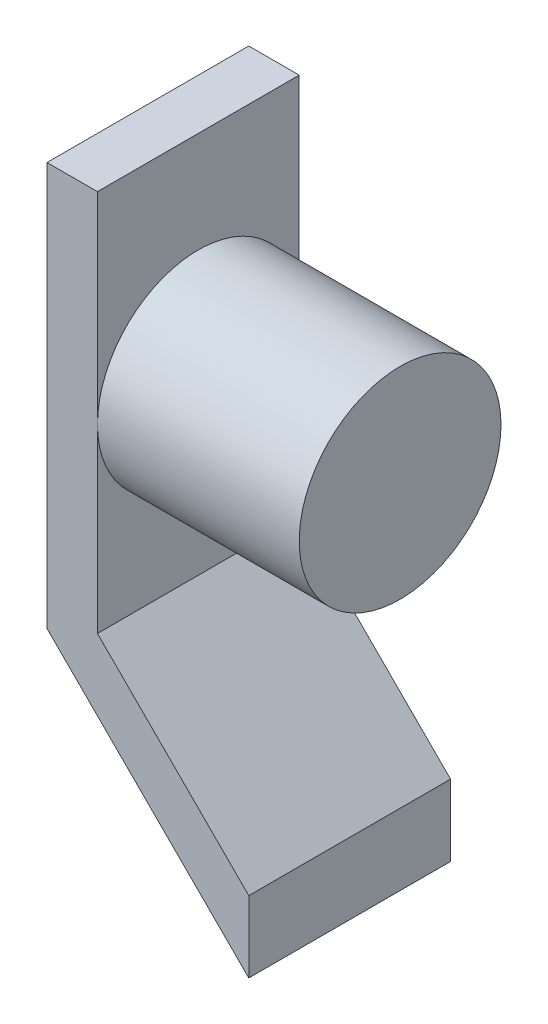
ISO-10303-21;
HEADER;
FILE_DESCRIPTION(('STEP AP214'),'2;1');
FILE_NAME('part.step','',(''),(''),'','','');
FILE_SCHEMA(('AUTOMOTIVE_DESIGN { 1 0 10303 214 1 1 1 1 }'));
ENDSEC;
DATA;
#1=APPLICATION_CONTEXT('core data for automotive mechanical design processes');
#2=APPLICATION_PROTOCOL_DEFINITION('international standard','automotive_design',2000,#1);
#3=PRODUCT_CONTEXT('',#1,'mechanical');
#4=PRODUCT('Part','Part','',(#3));
#5=PRODUCT_RELATED_PRODUCT_CATEGORY('part','',(#4));
#6=PRODUCT_DEFINITION_FORMATION('','',#4);
#7=PRODUCT_DEFINITION_CONTEXT('part definition',#1,'design');
#8=PRODUCT_DEFINITION('design','',#6,#7);
#9=PRODUCT_DEFINITION_SHAPE('','',#8);
#10=(LENGTH_UNIT() NAMED_UNIT(*) SI_UNIT(.MILLI.,.METRE.));
#11=(NAMED_UNIT(*) PLANE_ANGLE_UNIT() SI_UNIT($,.RADIAN.));
#12=(NAMED_UNIT(*) SI_UNIT($,.STERADIAN.) SOLID_ANGLE_UNIT());
#13=UNCERTAINTY_MEASURE_WITH_UNIT(LENGTH_MEASURE(1.E-05),#10,'distance_accuracy_value','');
#14=(GEOMETRIC_REPRESENTATION_CONTEXT(3) GLOBAL_UNCERTAINTY_ASSIGNED_CONTEXT((#13)) GLOBAL_UNIT_ASSIGNED_CONTEXT((#10,
#11,#12)) REPRESENTATION_CONTEXT('',''));
#15=CARTESIAN_POINT('',(0.,0.,0.));
#16=DIRECTION('',(0.,0.,1.));
#17=DIRECTION('',(1.,0.,0.));
#18=AXIS2_PLACEMENT_3D('',#15,#16,#17);
#19=CARTESIAN_POINT('',(3.175,22.225,12.7));
#20=DIRECTION('',(-1.,0.,0.));
#21=DIRECTION('',(0.,0.,1.));
#22=AXIS2_PLACEMENT_3D('',#19,#20,#21);
#23=PLANE('',#22);
#24=CARTESIAN_POINT('',(3.175,12.7,6.35));
#25=DIRECTION('',(1.,0.,0.));
#26=DIRECTION('',(0.,0.,-1.));
#27=AXIS2_PLACEMENT_3D('',#24,#25,#26);
#28=CIRCLE('',#27,6.35);
#29=CARTESIAN_POINT('',(3.175,12.7,12.7));
#30=VERTEX_POINT('',#29);
#31=CARTESIAN_POINT('',(3.175,12.7,0.));
#32=VERTEX_POINT('',#31);
#33=EDGE_CURVE('E169',#30,#32,#28,.T.);
#34=ORIENTED_EDGE('',*,*,#33,.F.);
#35=DIRECTION('',(0.,1.,0.));
#36=VECTOR('',#35,1.);
#37=CARTESIAN_POINT('',(3.175,1.31512806053458,12.7));
#38=LINE('',#37,#36);
#39=CARTESIAN_POINT('',(3.175,1.31512806053458,12.7));
#40=VERTEX_POINT('',#39);
#41=EDGE_CURVE('E114',#40,#30,#38,.T.);
#42=ORIENTED_EDGE('',*,*,#41,.F.);
#43=DIRECTION('',(0.,0.,-1.));
#44=VECTOR('',#43,1.);
#45=CARTESIAN_POINT('',(3.175,1.31512806053458,12.7));
#46=LINE('',#45,#44);
#47=CARTESIAN_POINT('',(3.175,1.31512806053458,0.));
#48=VERTEX_POINT('',#47);
#49=EDGE_CURVE('E124',#40,#48,#46,.T.);
#50=ORIENTED_EDGE('',*,*,#49,.T.);
#51=DIRECTION('',(0.,1.,0.));
#52=VECTOR('',#51,1.);
#53=CARTESIAN_POINT('',(3.175,22.225,0.));
#54=LINE('',#53,#52);
#55=EDGE_CURVE('E146',#48,#32,#54,.T.);
#56=ORIENTED_EDGE('',*,*,#55,.T.);
#57=EDGE_LOOP('',(#34,#42,#50,#56));
#58=FACE_BOUND('',#57,.T.);
#59=ADVANCED_FACE('F38',(#58),#23,.F.);
#60=EDGE_CURVE('E54',#32,#30,#28,.T.);
#61=ORIENTED_EDGE('',*,*,#60,.F.);
#62=CARTESIAN_POINT('',(3.175,25.4,0.));
#63=VERTEX_POINT('',#62);
#64=EDGE_CURVE('E121',#32,#63,#54,.T.);
#65=ORIENTED_EDGE('',*,*,#64,.T.);
#66=DIRECTION('',(0.,0.,-1.));
#67=VECTOR('',#66,1.);
#68=CARTESIAN_POINT('',(3.175,25.4,12.7));
#69=LINE('',#68,#67);
#70=CARTESIAN_POINT('',(3.175,25.4,12.7));
#71=VERTEX_POINT('',#70);
#72=EDGE_CURVE('E119',#71,#63,#69,.T.);
#73=ORIENTED_EDGE('',*,*,#72,.F.);
#74=EDGE_CURVE('E107',#30,#71,#38,.T.);
#75=ORIENTED_EDGE('',*,*,#74,.F.);
#76=EDGE_LOOP('',(#61,#65,#73,#75));
#77=FACE_BOUND('',#76,.T.);
#78=ADVANCED_FACE('F120',(#77),#23,.F.);
#79=CARTESIAN_POINT('',(12.7,-12.7,12.7));
#80=DIRECTION('',(0.707106781186548,0.707106781186548,0.));
#81=DIRECTION('',(-0.707106781186548,0.707106781186548,0.));
#82=AXIS2_PLACEMENT_3D('',#79,#80,#81);
#83=PLANE('',#82);
#84=DIRECTION('',(0.707106781186547,-0.707106781186547,0.));
#85=VECTOR('',#84,1.);
#86=CARTESIAN_POINT('',(12.7,-12.7,0.));
#87=LINE('',#86,#85);
#88=CARTESIAN_POINT('',(0.,0.,0.));
#89=VERTEX_POINT('',#88);
#90=CARTESIAN_POINT('',(12.7,-12.7,0.));
#91=VERTEX_POINT('',#90);
#92=EDGE_CURVE('E133',#89,#91,#87,.T.);
#93=ORIENTED_EDGE('',*,*,#92,.T.);
#94=DIRECTION('',(0.,0.,-1.));
#95=VECTOR('',#94,1.);
#96=CARTESIAN_POINT('',(12.7,-12.7,12.7));
#97=LINE('',#96,#95);
#98=CARTESIAN_POINT('',(12.7,-12.7,12.7));
#99=VERTEX_POINT('',#98);
#100=EDGE_CURVE('E11',#99,#91,#97,.T.);
#101=ORIENTED_EDGE('',*,*,#100,.F.);
#102=DIRECTION('',(0.707106781186547,-0.707106781186547,0.));
#103=VECTOR('',#102,1.);
#104=CARTESIAN_POINT('',(12.7,-12.7,12.7));
#105=LINE('',#104,#103);
#106=CARTESIAN_POINT('',(0.,0.,12.7));
#107=VERTEX_POINT('',#106);
#108=EDGE_CURVE('E152',#107,#99,#105,.T.);
#109=ORIENTED_EDGE('',*,*,#108,.F.);
#110=DIRECTION('',(0.,0.,-1.));
#111=VECTOR('',#110,1.);
#112=CARTESIAN_POINT('',(0.,0.,12.7));
#113=LINE('',#112,#111);
#114=EDGE_CURVE('E129',#107,#89,#113,.T.);
#115=ORIENTED_EDGE('',*,*,#114,.T.);
#116=EDGE_LOOP('',(#93,#101,#109,#115));
#117=FACE_BOUND('',#116,.T.);
#118=ADVANCED_FACE('F40',(#117),#83,.F.);
#119=CARTESIAN_POINT('',(12.7,-12.7,12.7));
#120=DIRECTION('',(-1.,0.,0.));
#121=DIRECTION('',(0.,0.,1.));
#122=AXIS2_PLACEMENT_3D('',#119,#120,#121);
#123=PLANE('',#122);
#124=DIRECTION('',(0.,1.,0.));
#125=VECTOR('',#124,1.);
#126=CARTESIAN_POINT('',(12.7,-12.7,0.));
#127=LINE('',#126,#125);
#128=CARTESIAN_POINT('',(12.7,-8.20987193946542,0.));
#129=VERTEX_POINT('',#128);
#130=EDGE_CURVE('E137',#91,#129,#127,.T.);
#131=ORIENTED_EDGE('',*,*,#130,.T.);
#132=DIRECTION('',(0.,0.,-1.));
#133=VECTOR('',#132,1.);
#134=CARTESIAN_POINT('',(12.7,-8.20987193946542,12.7));
#135=LINE('',#134,#133);
#136=CARTESIAN_POINT('',(12.7,-8.20987193946542,12.7));
#137=VERTEX_POINT('',#136);
#138=EDGE_CURVE('E47',#137,#129,#135,.T.);
#139=ORIENTED_EDGE('',*,*,#138,.F.);
#140=DIRECTION('',(0.,1.,0.));
#141=VECTOR('',#140,1.);
#142=CARTESIAN_POINT('',(12.7,-12.7,12.7));
#143=LINE('',#142,#141);
#144=EDGE_CURVE('E99',#99,#137,#143,.T.);
#145=ORIENTED_EDGE('',*,*,#144,.F.);
#146=ORIENTED_EDGE('',*,*,#100,.T.);
#147=EDGE_LOOP('',(#131,#139,#145,#146));
#148=FACE_BOUND('',#147,.T.);
#149=ADVANCED_FACE('F162',(#148),#123,.F.);
#150=CARTESIAN_POINT('',(9.525,-5.03487193946542,12.7));
#151=DIRECTION('',(-0.707106781186548,-0.707106781186547,0.));
#152=DIRECTION('',(0.707106781186547,-0.707106781186548,0.));
#153=AXIS2_PLACEMENT_3D('',#150,#151,#152);
#154=PLANE('',#153);
#155=DIRECTION('',(-0.707106781186547,0.707106781186548,0.));
#156=VECTOR('',#155,1.);
#157=CARTESIAN_POINT('',(9.525,-5.03487193946542,0.));
#158=LINE('',#157,#156);
#159=EDGE_CURVE('E142',#129,#48,#158,.T.);
#160=ORIENTED_EDGE('',*,*,#159,.T.);
#161=ORIENTED_EDGE('',*,*,#49,.F.);
#162=DIRECTION('',(-0.707106781186548,0.707106781186547,0.));
#163=VECTOR('',#162,1.);
#164=CARTESIAN_POINT('',(9.525,-5.03487193946542,12.7));
#165=LINE('',#164,#163);
#166=EDGE_CURVE('E116',#137,#40,#165,.T.);
#167=ORIENTED_EDGE('',*,*,#166,.F.);
#168=ORIENTED_EDGE('',*,*,#138,.T.);
#169=EDGE_LOOP('',(#160,#161,#167,#168));
#170=FACE_BOUND('',#169,.T.);
#171=ADVANCED_FACE('F160',(#170),#154,.F.);
#172=CARTESIAN_POINT('',(0.,25.4,12.7));
#173=DIRECTION('',(0.,-1.,0.));
#174=DIRECTION('',(0.,0.,-1.));
#175=AXIS2_PLACEMENT_3D('',#172,#173,#174);
#176=PLANE('',#175);
#177=DIRECTION('',(-1.,0.,0.));
#178=VECTOR('',#177,1.);
#179=CARTESIAN_POINT('',(0.,25.4,0.));
#180=LINE('',#179,#178);
#181=CARTESIAN_POINT('',(0.,25.4,0.));
#182=VERTEX_POINT('',#181);
#183=EDGE_CURVE('E149',#63,#182,#180,.T.);
#184=ORIENTED_EDGE('',*,*,#183,.T.);
#185=DIRECTION('',(0.,0.,-1.));
#186=VECTOR('',#185,1.);
#187=CARTESIAN_POINT('',(0.,25.4,12.7));
#188=LINE('',#187,#186);
#189=CARTESIAN_POINT('',(0.,25.4,12.7));
#190=VERTEX_POINT('',#189);
#191=EDGE_CURVE('E125',#190,#182,#188,.T.);
#192=ORIENTED_EDGE('',*,*,#191,.F.);
#193=DIRECTION('',(-1.,0.,0.));
#194=VECTOR('',#193,1.);
#195=CARTESIAN_POINT('',(0.,25.4,12.7));
#196=LINE('',#195,#194);
#197=EDGE_CURVE('E111',#71,#190,#196,.T.);
#198=ORIENTED_EDGE('',*,*,#197,.F.);
#199=ORIENTED_EDGE('',*,*,#72,.T.);
#200=EDGE_LOOP('',(#184,#192,#198,#199));
#201=FACE_BOUND('',#200,.T.);
#202=ADVANCED_FACE('F127',(#201),#176,.F.);
#203=CARTESIAN_POINT('',(0.,0.,12.7));
#204=DIRECTION('',(1.,0.,0.));
#205=DIRECTION('',(0.,0.,-1.));
#206=AXIS2_PLACEMENT_3D('',#203,#204,#205);
#207=PLANE('',#206);
#208=DIRECTION('',(0.,-1.,0.));
#209=VECTOR('',#208,1.);
#210=CARTESIAN_POINT('',(0.,0.,0.));
#211=LINE('',#210,#209);
#212=EDGE_CURVE('E91',#182,#89,#211,.T.);
#213=ORIENTED_EDGE('',*,*,#212,.T.);
#214=ORIENTED_EDGE('',*,*,#114,.F.);
#215=DIRECTION('',(0.,-1.,0.));
#216=VECTOR('',#215,1.);
#217=CARTESIAN_POINT('',(0.,0.,12.7));
#218=LINE('',#217,#216);
#219=EDGE_CURVE('E63',#190,#107,#218,.T.);
#220=ORIENTED_EDGE('',*,*,#219,.F.);
#221=ORIENTED_EDGE('',*,*,#191,.T.);
#222=EDGE_LOOP('',(#213,#214,#220,#221));
#223=FACE_BOUND('',#222,.T.);
#224=ADVANCED_FACE('F178',(#223),#207,.F.);
#225=CARTESIAN_POINT('',(0.,0.,12.7));
#226=DIRECTION('',(0.,0.,-1.));
#227=DIRECTION('',(-1.,0.,0.));
#228=AXIS2_PLACEMENT_3D('',#225,#226,#227);
#229=PLANE('',#228);
#230=ORIENTED_EDGE('',*,*,#108,.T.);
#231=ORIENTED_EDGE('',*,*,#144,.T.);
#232=ORIENTED_EDGE('',*,*,#166,.T.);
#233=ORIENTED_EDGE('',*,*,#41,.T.);
#234=ORIENTED_EDGE('',*,*,#74,.T.);
#235=ORIENTED_EDGE('',*,*,#197,.T.);
#236=ORIENTED_EDGE('',*,*,#219,.T.);
#237=EDGE_LOOP('',(#230,#231,#232,#233,#234,#235,#236));
#238=FACE_BOUND('',#237,.T.);
#239=ADVANCED_FACE('F109',(#238),#229,.F.);
#240=CARTESIAN_POINT('',(0.,0.,0.));
#241=DIRECTION('',(0.,0.,-1.));
#242=DIRECTION('',(-1.,0.,0.));
#243=AXIS2_PLACEMENT_3D('',#240,#241,#242);
#244=PLANE('',#243);
#245=ORIENTED_EDGE('',*,*,#92,.F.);
#246=ORIENTED_EDGE('',*,*,#212,.F.);
#247=ORIENTED_EDGE('',*,*,#183,.F.);
#248=ORIENTED_EDGE('',*,*,#64,.F.);
#249=ORIENTED_EDGE('',*,*,#55,.F.);
#250=ORIENTED_EDGE('',*,*,#159,.F.);
#251=ORIENTED_EDGE('',*,*,#130,.F.);
#252=EDGE_LOOP('',(#245,#246,#247,#248,#249,#250,#251));
#253=FACE_BOUND('',#252,.T.);
#254=ADVANCED_FACE('F166',(#253),#244,.T.);
#255=CARTESIAN_POINT('',(15.875,12.7,6.35));
#256=DIRECTION('',(-1.,0.,0.));
#257=DIRECTION('',(0.,0.,1.));
#258=AXIS2_PLACEMENT_3D('',#255,#256,#257);
#259=CYLINDRICAL_SURFACE('',#258,6.35);
#260=CARTESIAN_POINT('',(15.875,12.7,6.35));
#261=DIRECTION('',(1.,0.,0.));
#262=DIRECTION('',(0.,0.,-1.));
#263=AXIS2_PLACEMENT_3D('',#260,#261,#262);
#264=CIRCLE('',#263,6.35);
#265=CARTESIAN_POINT('',(15.875,12.7,0.));
#266=VERTEX_POINT('',#265);
#267=EDGE_CURVE('E138',#266,#266,#264,.T.);
#268=ORIENTED_EDGE('',*,*,#267,.F.);
#269=EDGE_LOOP('',(#268));
#270=FACE_BOUND('',#269,.T.);
#271=ORIENTED_EDGE('',*,*,#60,.T.);
#272=ORIENTED_EDGE('',*,*,#33,.T.);
#273=EDGE_LOOP('',(#271,#272));
#274=FACE_BOUND('',#273,.T.);
#275=ADVANCED_FACE('F171',(#270,#274),#259,.T.);
#276=CARTESIAN_POINT('',(15.875,12.7,6.35));
#277=DIRECTION('',(1.,0.,0.));
#278=DIRECTION('',(0.,0.,-1.));
#279=AXIS2_PLACEMENT_3D('',#276,#277,#278);
#280=PLANE('',#279);
#281=ORIENTED_EDGE('',*,*,#267,.T.);
#282=EDGE_LOOP('',(#281));
#283=FACE_BOUND('',#282,.T.);
#284=ADVANCED_FACE('F228',(#283),#280,.T.);
#285=CLOSED_SHELL('',(#59,#78,#118,#149,#171,#202,#224,#239,#254,#275,#284));
#286=MANIFOLD_SOLID_BREP('B2',#285);
#287=ADVANCED_BREP_SHAPE_REPRESENTATION('',(#18,#286),#14);
#288=SHAPE_DEFINITION_REPRESENTATION(#9,#287);
ENDSEC;
END-ISO-10303-21;
